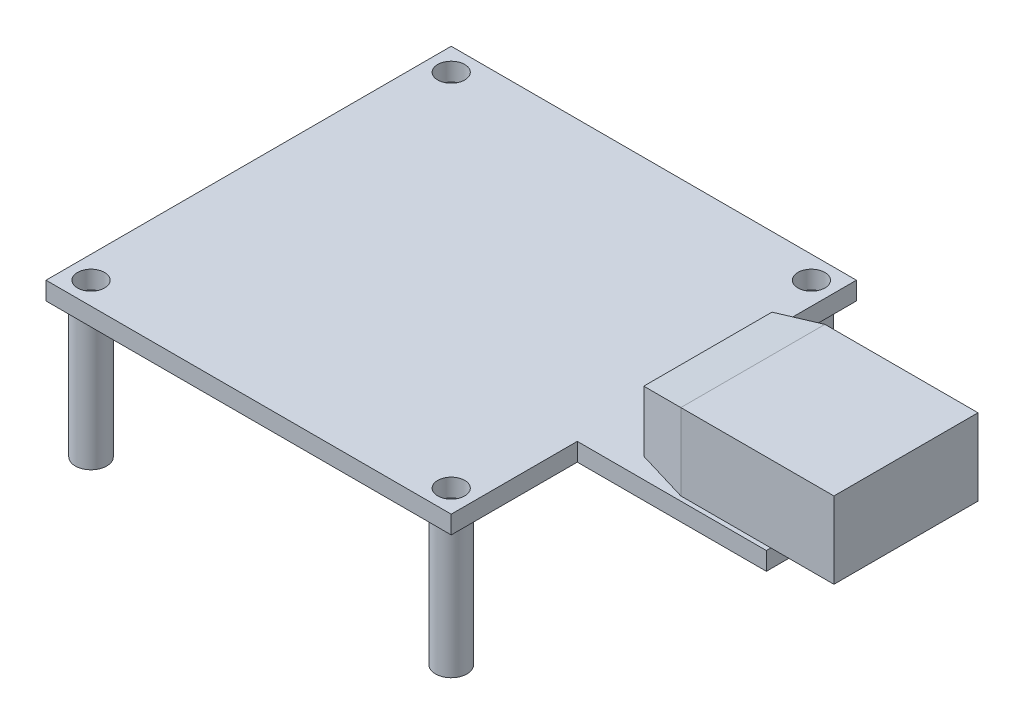
ISO-10303-21;
HEADER;
FILE_DESCRIPTION(('STEP AP214'),'2;1');
FILE_NAME('part.step','',(''),(''),'','','');
FILE_SCHEMA(('AUTOMOTIVE_DESIGN { 1 0 10303 214 1 1 1 1 }'));
ENDSEC;
DATA;
#1=APPLICATION_CONTEXT('core data for automotive mechanical design processes');
#2=APPLICATION_PROTOCOL_DEFINITION('international standard','automotive_design',2000,#1);
#3=PRODUCT_CONTEXT('',#1,'mechanical');
#4=PRODUCT('Part','Part','',(#3));
#5=PRODUCT_RELATED_PRODUCT_CATEGORY('part','',(#4));
#6=PRODUCT_DEFINITION_FORMATION('','',#4);
#7=PRODUCT_DEFINITION_CONTEXT('part definition',#1,'design');
#8=PRODUCT_DEFINITION('design','',#6,#7);
#9=PRODUCT_DEFINITION_SHAPE('','',#8);
#10=(LENGTH_UNIT() NAMED_UNIT(*) SI_UNIT(.MILLI.,.METRE.));
#11=(NAMED_UNIT(*) PLANE_ANGLE_UNIT() SI_UNIT($,.RADIAN.));
#12=(NAMED_UNIT(*) SI_UNIT($,.STERADIAN.) SOLID_ANGLE_UNIT());
#13=UNCERTAINTY_MEASURE_WITH_UNIT(LENGTH_MEASURE(1.E-05),#10,'distance_accuracy_value','');
#14=(GEOMETRIC_REPRESENTATION_CONTEXT(3) GLOBAL_UNCERTAINTY_ASSIGNED_CONTEXT((#13)) GLOBAL_UNIT_ASSIGNED_CONTEXT((#10,
#11,#12)) REPRESENTATION_CONTEXT('',''));
#15=CARTESIAN_POINT('',(0.,0.,0.));
#16=DIRECTION('',(0.,0.,1.));
#17=DIRECTION('',(1.,0.,0.));
#18=AXIS2_PLACEMENT_3D('',#15,#16,#17);
#19=CARTESIAN_POINT('',(-20.,-15.,-20.));
#20=DIRECTION('',(0.,1.,0.));
#21=DIRECTION('',(0.,0.,1.));
#22=AXIS2_PLACEMENT_3D('',#19,#20,#21);
#23=PLANE('',#22);
#24=CARTESIAN_POINT('',(-20.,-15.,-20.));
#25=DIRECTION('',(0.,-1.,0.));
#26=DIRECTION('',(0.,0.,1.));
#27=AXIS2_PLACEMENT_3D('',#24,#25,#26);
#28=CIRCLE('',#27,1.75);
#29=CARTESIAN_POINT('',(-20.,-15.,-18.25));
#30=VERTEX_POINT('',#29);
#31=EDGE_CURVE('E62',#30,#30,#28,.T.);
#32=ORIENTED_EDGE('',*,*,#31,.T.);
#33=EDGE_LOOP('',(#32));
#34=FACE_BOUND('',#33,.T.);
#35=CARTESIAN_POINT('',(-20.,-15.,-20.));
#36=DIRECTION('',(0.,-1.,0.));
#37=DIRECTION('',(0.,0.,1.));
#38=AXIS2_PLACEMENT_3D('',#35,#36,#37);
#39=CIRCLE('',#38,1.);
#40=CARTESIAN_POINT('',(-20.,-15.,-19.));
#41=VERTEX_POINT('',#40);
#42=EDGE_CURVE('E53',#41,#41,#39,.T.);
#43=ORIENTED_EDGE('',*,*,#42,.F.);
#44=EDGE_LOOP('',(#43));
#45=FACE_BOUND('',#44,.T.);
#46=ADVANCED_FACE('F49',(#34,#45),#23,.F.);
#47=CARTESIAN_POINT('',(-20.,0.,-20.));
#48=DIRECTION('',(0.,1.,0.));
#49=DIRECTION('',(0.,0.,1.));
#50=AXIS2_PLACEMENT_3D('',#47,#48,#49);
#51=PLANE('',#50);
#52=CARTESIAN_POINT('',(-20.,0.,-20.));
#53=DIRECTION('',(0.,-1.,0.));
#54=DIRECTION('',(0.,0.,1.));
#55=AXIS2_PLACEMENT_3D('',#52,#53,#54);
#56=CIRCLE('',#55,1.75);
#57=CARTESIAN_POINT('',(-20.,0.,-18.25));
#58=VERTEX_POINT('',#57);
#59=EDGE_CURVE('E60',#58,#58,#56,.T.);
#60=ORIENTED_EDGE('',*,*,#59,.F.);
#61=EDGE_LOOP('',(#60));
#62=FACE_BOUND('',#61,.T.);
#63=CARTESIAN_POINT('',(-20.,0.,-20.));
#64=DIRECTION('',(0.,-1.,0.));
#65=DIRECTION('',(0.,0.,1.));
#66=AXIS2_PLACEMENT_3D('',#63,#64,#65);
#67=CIRCLE('',#66,1.);
#68=CARTESIAN_POINT('',(-20.,0.,-19.));
#69=VERTEX_POINT('',#68);
#70=EDGE_CURVE('E11',#69,#69,#67,.T.);
#71=ORIENTED_EDGE('',*,*,#70,.T.);
#72=EDGE_LOOP('',(#71));
#73=FACE_BOUND('',#72,.T.);
#74=ADVANCED_FACE('F70',(#62,#73),#51,.T.);
#75=CARTESIAN_POINT('',(-20.,-15.,-20.));
#76=DIRECTION('',(0.,1.,0.));
#77=DIRECTION('',(0.,0.,1.));
#78=AXIS2_PLACEMENT_3D('',#75,#76,#77);
#79=CYLINDRICAL_SURFACE('',#78,1.75);
#80=ORIENTED_EDGE('',*,*,#31,.F.);
#81=EDGE_LOOP('',(#80));
#82=FACE_BOUND('',#81,.T.);
#83=ORIENTED_EDGE('',*,*,#59,.T.);
#84=EDGE_LOOP('',(#83));
#85=FACE_BOUND('',#84,.T.);
#86=ADVANCED_FACE('F68',(#82,#85),#79,.T.);
#87=CARTESIAN_POINT('',(-20.,-15.,-20.));
#88=DIRECTION('',(0.,1.,0.));
#89=DIRECTION('',(0.,0.,1.));
#90=AXIS2_PLACEMENT_3D('',#87,#88,#89);
#91=CYLINDRICAL_SURFACE('',#90,1.);
#92=ORIENTED_EDGE('',*,*,#42,.T.);
#93=EDGE_LOOP('',(#92));
#94=FACE_BOUND('',#93,.T.);
#95=ORIENTED_EDGE('',*,*,#70,.F.);
#96=EDGE_LOOP('',(#95));
#97=FACE_BOUND('',#96,.T.);
#98=ADVANCED_FACE('F51',(#94,#97),#91,.F.);
#99=CLOSED_SHELL('',(#46,#74,#86,#98));
#100=MANIFOLD_SOLID_BREP('B2',#99);
#101=CARTESIAN_POINT('',(20.,-15.,-20.));
#102=DIRECTION('',(0.,-1.,0.));
#103=DIRECTION('',(0.,0.,-1.));
#104=AXIS2_PLACEMENT_3D('',#101,#102,#103);
#105=PLANE('',#104);
#106=CARTESIAN_POINT('',(20.,-15.,-20.));
#107=DIRECTION('',(0.,-1.,0.));
#108=DIRECTION('',(0.,0.,-1.));
#109=AXIS2_PLACEMENT_3D('',#106,#107,#108);
#110=CIRCLE('',#109,1.75);
#111=CARTESIAN_POINT('',(20.,-15.,-21.75));
#112=VERTEX_POINT('',#111);
#113=EDGE_CURVE('E139',#112,#112,#110,.T.);
#114=ORIENTED_EDGE('',*,*,#113,.T.);
#115=EDGE_LOOP('',(#114));
#116=FACE_BOUND('',#115,.T.);
#117=CARTESIAN_POINT('',(20.,-15.,-20.));
#118=DIRECTION('',(0.,-1.,0.));
#119=DIRECTION('',(0.,0.,-1.));
#120=AXIS2_PLACEMENT_3D('',#117,#118,#119);
#121=CIRCLE('',#120,1.);
#122=CARTESIAN_POINT('',(20.,-15.,-21.));
#123=VERTEX_POINT('',#122);
#124=EDGE_CURVE('E130',#123,#123,#121,.T.);
#125=ORIENTED_EDGE('',*,*,#124,.F.);
#126=EDGE_LOOP('',(#125));
#127=FACE_BOUND('',#126,.T.);
#128=ADVANCED_FACE('F126',(#116,#127),#105,.T.);
#129=CARTESIAN_POINT('',(20.,0.,-20.));
#130=DIRECTION('',(0.,-1.,0.));
#131=DIRECTION('',(0.,0.,-1.));
#132=AXIS2_PLACEMENT_3D('',#129,#130,#131);
#133=PLANE('',#132);
#134=CARTESIAN_POINT('',(20.,0.,-20.));
#135=DIRECTION('',(0.,-1.,0.));
#136=DIRECTION('',(0.,0.,-1.));
#137=AXIS2_PLACEMENT_3D('',#134,#135,#136);
#138=CIRCLE('',#137,1.75);
#139=CARTESIAN_POINT('',(20.,0.,-21.75));
#140=VERTEX_POINT('',#139);
#141=EDGE_CURVE('E137',#140,#140,#138,.T.);
#142=ORIENTED_EDGE('',*,*,#141,.F.);
#143=EDGE_LOOP('',(#142));
#144=FACE_BOUND('',#143,.T.);
#145=CARTESIAN_POINT('',(20.,0.,-20.));
#146=DIRECTION('',(0.,-1.,0.));
#147=DIRECTION('',(0.,0.,-1.));
#148=AXIS2_PLACEMENT_3D('',#145,#146,#147);
#149=CIRCLE('',#148,1.);
#150=CARTESIAN_POINT('',(20.,0.,-21.));
#151=VERTEX_POINT('',#150);
#152=EDGE_CURVE('E48',#151,#151,#149,.T.);
#153=ORIENTED_EDGE('',*,*,#152,.T.);
#154=EDGE_LOOP('',(#153));
#155=FACE_BOUND('',#154,.T.);
#156=ADVANCED_FACE('F147',(#144,#155),#133,.F.);
#157=CARTESIAN_POINT('',(20.,-15.,-20.));
#158=DIRECTION('',(0.,1.,0.));
#159=DIRECTION('',(0.,0.,1.));
#160=AXIS2_PLACEMENT_3D('',#157,#158,#159);
#161=CYLINDRICAL_SURFACE('',#160,1.75);
#162=ORIENTED_EDGE('',*,*,#113,.F.);
#163=EDGE_LOOP('',(#162));
#164=FACE_BOUND('',#163,.T.);
#165=ORIENTED_EDGE('',*,*,#141,.T.);
#166=EDGE_LOOP('',(#165));
#167=FACE_BOUND('',#166,.T.);
#168=ADVANCED_FACE('F145',(#164,#167),#161,.T.);
#169=CARTESIAN_POINT('',(20.,-15.,-20.));
#170=DIRECTION('',(0.,1.,0.));
#171=DIRECTION('',(0.,0.,1.));
#172=AXIS2_PLACEMENT_3D('',#169,#170,#171);
#173=CYLINDRICAL_SURFACE('',#172,1.);
#174=ORIENTED_EDGE('',*,*,#124,.T.);
#175=EDGE_LOOP('',(#174));
#176=FACE_BOUND('',#175,.T.);
#177=ORIENTED_EDGE('',*,*,#152,.F.);
#178=EDGE_LOOP('',(#177));
#179=FACE_BOUND('',#178,.T.);
#180=ADVANCED_FACE('F128',(#176,#179),#173,.F.);
#181=CLOSED_SHELL('',(#128,#156,#168,#180));
#182=MANIFOLD_SOLID_BREP('B6',#181);
#183=CARTESIAN_POINT('',(20.,-15.,20.));
#184=DIRECTION('',(0.,1.,0.));
#185=DIRECTION('',(0.,0.,1.));
#186=AXIS2_PLACEMENT_3D('',#183,#184,#185);
#187=PLANE('',#186);
#188=CARTESIAN_POINT('',(20.,-15.,20.));
#189=DIRECTION('',(0.,-1.,0.));
#190=DIRECTION('',(0.,0.,1.));
#191=AXIS2_PLACEMENT_3D('',#188,#189,#190);
#192=CIRCLE('',#191,1.75);
#193=CARTESIAN_POINT('',(20.,-15.,21.75));
#194=VERTEX_POINT('',#193);
#195=EDGE_CURVE('E216',#194,#194,#192,.T.);
#196=ORIENTED_EDGE('',*,*,#195,.T.);
#197=EDGE_LOOP('',(#196));
#198=FACE_BOUND('',#197,.T.);
#199=CARTESIAN_POINT('',(20.,-15.,20.));
#200=DIRECTION('',(0.,-1.,0.));
#201=DIRECTION('',(0.,0.,1.));
#202=AXIS2_PLACEMENT_3D('',#199,#200,#201);
#203=CIRCLE('',#202,1.);
#204=CARTESIAN_POINT('',(20.,-15.,21.));
#205=VERTEX_POINT('',#204);
#206=EDGE_CURVE('E207',#205,#205,#203,.T.);
#207=ORIENTED_EDGE('',*,*,#206,.F.);
#208=EDGE_LOOP('',(#207));
#209=FACE_BOUND('',#208,.T.);
#210=ADVANCED_FACE('F203',(#198,#209),#187,.F.);
#211=CARTESIAN_POINT('',(20.,0.,20.));
#212=DIRECTION('',(0.,1.,0.));
#213=DIRECTION('',(0.,0.,1.));
#214=AXIS2_PLACEMENT_3D('',#211,#212,#213);
#215=PLANE('',#214);
#216=CARTESIAN_POINT('',(20.,0.,20.));
#217=DIRECTION('',(0.,-1.,0.));
#218=DIRECTION('',(0.,0.,1.));
#219=AXIS2_PLACEMENT_3D('',#216,#217,#218);
#220=CIRCLE('',#219,1.75);
#221=CARTESIAN_POINT('',(20.,0.,21.75));
#222=VERTEX_POINT('',#221);
#223=EDGE_CURVE('E214',#222,#222,#220,.T.);
#224=ORIENTED_EDGE('',*,*,#223,.F.);
#225=EDGE_LOOP('',(#224));
#226=FACE_BOUND('',#225,.T.);
#227=CARTESIAN_POINT('',(20.,0.,20.));
#228=DIRECTION('',(0.,-1.,0.));
#229=DIRECTION('',(0.,0.,1.));
#230=AXIS2_PLACEMENT_3D('',#227,#228,#229);
#231=CIRCLE('',#230,1.);
#232=CARTESIAN_POINT('',(20.,0.,21.));
#233=VERTEX_POINT('',#232);
#234=EDGE_CURVE('E125',#233,#233,#231,.T.);
#235=ORIENTED_EDGE('',*,*,#234,.T.);
#236=EDGE_LOOP('',(#235));
#237=FACE_BOUND('',#236,.T.);
#238=ADVANCED_FACE('F224',(#226,#237),#215,.T.);
#239=CARTESIAN_POINT('',(20.,-15.,20.));
#240=DIRECTION('',(0.,1.,0.));
#241=DIRECTION('',(0.,0.,1.));
#242=AXIS2_PLACEMENT_3D('',#239,#240,#241);
#243=CYLINDRICAL_SURFACE('',#242,1.75);
#244=ORIENTED_EDGE('',*,*,#195,.F.);
#245=EDGE_LOOP('',(#244));
#246=FACE_BOUND('',#245,.T.);
#247=ORIENTED_EDGE('',*,*,#223,.T.);
#248=EDGE_LOOP('',(#247));
#249=FACE_BOUND('',#248,.T.);
#250=ADVANCED_FACE('F222',(#246,#249),#243,.T.);
#251=CARTESIAN_POINT('',(20.,-15.,20.));
#252=DIRECTION('',(0.,1.,0.));
#253=DIRECTION('',(0.,0.,1.));
#254=AXIS2_PLACEMENT_3D('',#251,#252,#253);
#255=CYLINDRICAL_SURFACE('',#254,1.);
#256=ORIENTED_EDGE('',*,*,#206,.T.);
#257=EDGE_LOOP('',(#256));
#258=FACE_BOUND('',#257,.T.);
#259=ORIENTED_EDGE('',*,*,#234,.F.);
#260=EDGE_LOOP('',(#259));
#261=FACE_BOUND('',#260,.T.);
#262=ADVANCED_FACE('F205',(#258,#261),#255,.F.);
#263=CLOSED_SHELL('',(#210,#238,#250,#262));
#264=MANIFOLD_SOLID_BREP('B43',#263);
#265=CARTESIAN_POINT('',(-20.,-15.,20.));
#266=DIRECTION('',(0.,-1.,0.));
#267=DIRECTION('',(0.,0.,-1.));
#268=AXIS2_PLACEMENT_3D('',#265,#266,#267);
#269=PLANE('',#268);
#270=CARTESIAN_POINT('',(-20.,-15.,20.));
#271=DIRECTION('',(0.,-1.,0.));
#272=DIRECTION('',(0.,0.,-1.));
#273=AXIS2_PLACEMENT_3D('',#270,#271,#272);
#274=CIRCLE('',#273,1.75);
#275=CARTESIAN_POINT('',(-20.,-15.,18.25));
#276=VERTEX_POINT('',#275);
#277=EDGE_CURVE('E202',#276,#276,#274,.T.);
#278=ORIENTED_EDGE('',*,*,#277,.T.);
#279=EDGE_LOOP('',(#278));
#280=FACE_BOUND('',#279,.T.);
#281=CARTESIAN_POINT('',(-20.,-15.,20.));
#282=DIRECTION('',(0.,-1.,0.));
#283=DIRECTION('',(0.,0.,-1.));
#284=AXIS2_PLACEMENT_3D('',#281,#282,#283);
#285=CIRCLE('',#284,1.);
#286=CARTESIAN_POINT('',(-20.,-15.,19.));
#287=VERTEX_POINT('',#286);
#288=EDGE_CURVE('E292',#287,#287,#285,.T.);
#289=ORIENTED_EDGE('',*,*,#288,.F.);
#290=EDGE_LOOP('',(#289));
#291=FACE_BOUND('',#290,.T.);
#292=ADVANCED_FACE('F281',(#280,#291),#269,.T.);
#293=CARTESIAN_POINT('',(-20.,0.,20.));
#294=DIRECTION('',(0.,-1.,0.));
#295=DIRECTION('',(0.,0.,-1.));
#296=AXIS2_PLACEMENT_3D('',#293,#294,#295);
#297=PLANE('',#296);
#298=CARTESIAN_POINT('',(-20.,0.,20.));
#299=DIRECTION('',(0.,-1.,0.));
#300=DIRECTION('',(0.,0.,-1.));
#301=AXIS2_PLACEMENT_3D('',#298,#299,#300);
#302=CIRCLE('',#301,1.75);
#303=CARTESIAN_POINT('',(-20.,0.,18.25));
#304=VERTEX_POINT('',#303);
#305=EDGE_CURVE('E285',#304,#304,#302,.T.);
#306=ORIENTED_EDGE('',*,*,#305,.F.);
#307=EDGE_LOOP('',(#306));
#308=FACE_BOUND('',#307,.T.);
#309=CARTESIAN_POINT('',(-20.,0.,20.));
#310=DIRECTION('',(0.,-1.,0.));
#311=DIRECTION('',(0.,0.,-1.));
#312=AXIS2_PLACEMENT_3D('',#309,#310,#311);
#313=CIRCLE('',#312,1.);
#314=CARTESIAN_POINT('',(-20.,0.,19.));
#315=VERTEX_POINT('',#314);
#316=EDGE_CURVE('E294',#315,#315,#313,.T.);
#317=ORIENTED_EDGE('',*,*,#316,.T.);
#318=EDGE_LOOP('',(#317));
#319=FACE_BOUND('',#318,.T.);
#320=ADVANCED_FACE('F304',(#308,#319),#297,.F.);
#321=CARTESIAN_POINT('',(-20.,-15.,20.));
#322=DIRECTION('',(0.,1.,0.));
#323=DIRECTION('',(0.,0.,1.));
#324=AXIS2_PLACEMENT_3D('',#321,#322,#323);
#325=CYLINDRICAL_SURFACE('',#324,1.75);
#326=ORIENTED_EDGE('',*,*,#277,.F.);
#327=EDGE_LOOP('',(#326));
#328=FACE_BOUND('',#327,.T.);
#329=ORIENTED_EDGE('',*,*,#305,.T.);
#330=EDGE_LOOP('',(#329));
#331=FACE_BOUND('',#330,.T.);
#332=ADVANCED_FACE('F283',(#328,#331),#325,.T.);
#333=CARTESIAN_POINT('',(-20.,-15.,20.));
#334=DIRECTION('',(0.,1.,0.));
#335=DIRECTION('',(0.,0.,1.));
#336=AXIS2_PLACEMENT_3D('',#333,#334,#335);
#337=CYLINDRICAL_SURFACE('',#336,1.);
#338=ORIENTED_EDGE('',*,*,#288,.T.);
#339=EDGE_LOOP('',(#338));
#340=FACE_BOUND('',#339,.T.);
#341=ORIENTED_EDGE('',*,*,#316,.F.);
#342=EDGE_LOOP('',(#341));
#343=FACE_BOUND('',#342,.T.);
#344=ADVANCED_FACE('F300',(#340,#343),#337,.F.);
#345=CLOSED_SHELL('',(#292,#320,#332,#344));
#346=MANIFOLD_SOLID_BREP('B120',#345);
#347=CARTESIAN_POINT('',(0.,2.,0.));
#348=DIRECTION('',(0.,1.,0.));
#349=DIRECTION('',(0.,0.,1.));
#350=AXIS2_PLACEMENT_3D('',#347,#348,#349);
#351=PLANE('',#350);
#352=CARTESIAN_POINT('',(20.,2.,20.));
#353=DIRECTION('',(0.,1.,0.));
#354=DIRECTION('',(0.,0.,1.));
#355=AXIS2_PLACEMENT_3D('',#352,#353,#354);
#356=CIRCLE('',#355,1.5);
#357=CARTESIAN_POINT('',(20.,2.,21.5));
#358=VERTEX_POINT('',#357);
#359=EDGE_CURVE('E530',#358,#358,#356,.T.);
#360=ORIENTED_EDGE('',*,*,#359,.F.);
#361=EDGE_LOOP('',(#360));
#362=FACE_BOUND('',#361,.T.);
#363=CARTESIAN_POINT('',(20.,2.,-20.));
#364=DIRECTION('',(0.,1.,0.));
#365=DIRECTION('',(0.,0.,1.));
#366=AXIS2_PLACEMENT_3D('',#363,#364,#365);
#367=CIRCLE('',#366,1.5);
#368=CARTESIAN_POINT('',(20.,2.,-18.5));
#369=VERTEX_POINT('',#368);
#370=EDGE_CURVE('E534',#369,#369,#367,.F.);
#371=ORIENTED_EDGE('',*,*,#370,.T.);
#372=EDGE_LOOP('',(#371));
#373=FACE_BOUND('',#372,.T.);
#374=CARTESIAN_POINT('',(-20.,2.,-20.));
#375=DIRECTION('',(0.,1.,0.));
#376=DIRECTION('',(0.,0.,1.));
#377=AXIS2_PLACEMENT_3D('',#374,#375,#376);
#378=CIRCLE('',#377,1.5);
#379=CARTESIAN_POINT('',(-20.,2.,-18.5));
#380=VERTEX_POINT('',#379);
#381=EDGE_CURVE('E539',#380,#380,#378,.T.);
#382=ORIENTED_EDGE('',*,*,#381,.F.);
#383=EDGE_LOOP('',(#382));
#384=FACE_BOUND('',#383,.T.);
#385=CARTESIAN_POINT('',(-20.,2.,20.));
#386=DIRECTION('',(0.,1.,0.));
#387=DIRECTION('',(0.,0.,1.));
#388=AXIS2_PLACEMENT_3D('',#385,#386,#387);
#389=CIRCLE('',#388,1.5);
#390=CARTESIAN_POINT('',(-20.,2.,21.5));
#391=VERTEX_POINT('',#390);
#392=EDGE_CURVE('E570',#391,#391,#389,.F.);
#393=ORIENTED_EDGE('',*,*,#392,.T.);
#394=EDGE_LOOP('',(#393));
#395=FACE_BOUND('',#394,.T.);
#396=DIRECTION('',(0.,0.,1.));
#397=VECTOR('',#396,1.);
#398=CARTESIAN_POINT('',(43.5,2.,0.));
#399=LINE('',#398,#397);
#400=CARTESIAN_POINT('',(43.5,2.,8.));
#401=VERTEX_POINT('',#400);
#402=CARTESIAN_POINT('',(43.5,2.,8.50000000000001));
#403=VERTEX_POINT('',#402);
#404=EDGE_CURVE('E369',#401,#403,#399,.T.);
#405=ORIENTED_EDGE('',*,*,#404,.F.);
#406=DIRECTION('',(-1.,0.,0.));
#407=VECTOR('',#406,1.);
#408=CARTESIAN_POINT('',(50.5,2.,8.));
#409=LINE('',#408,#407);
#410=CARTESIAN_POINT('',(33.5,2.,8.));
#411=VERTEX_POINT('',#410);
#412=EDGE_CURVE('E279',#401,#411,#409,.T.);
#413=ORIENTED_EDGE('',*,*,#412,.T.);
#414=DIRECTION('',(0.,0.,-1.));
#415=VECTOR('',#414,1.);
#416=CARTESIAN_POINT('',(33.5,2.,8.));
#417=LINE('',#416,#415);
#418=CARTESIAN_POINT('',(33.5,2.,-8.));
#419=VERTEX_POINT('',#418);
#420=EDGE_CURVE('E476',#411,#419,#417,.T.);
#421=ORIENTED_EDGE('',*,*,#420,.T.);
#422=DIRECTION('',(-1.,0.,0.));
#423=VECTOR('',#422,1.);
#424=CARTESIAN_POINT('',(50.5,2.,-8.));
#425=LINE('',#424,#423);
#426=CARTESIAN_POINT('',(43.5,2.,-8.));
#427=VERTEX_POINT('',#426);
#428=EDGE_CURVE('E361',#427,#419,#425,.T.);
#429=ORIENTED_EDGE('',*,*,#428,.F.);
#430=CARTESIAN_POINT('',(43.5,2.,-8.49999999999999));
#431=VERTEX_POINT('',#430);
#432=EDGE_CURVE('E554',#431,#427,#399,.T.);
#433=ORIENTED_EDGE('',*,*,#432,.F.);
#434=DIRECTION('',(1.,0.,0.));
#435=VECTOR('',#434,1.);
#436=CARTESIAN_POINT('',(0.,2.,-8.49999999999999));
#437=LINE('',#436,#435);
#438=CARTESIAN_POINT('',(22.5,2.,-8.49999999999999));
#439=VERTEX_POINT('',#438);
#440=EDGE_CURVE('E557',#439,#431,#437,.T.);
#441=ORIENTED_EDGE('',*,*,#440,.F.);
#442=DIRECTION('',(0.,0.,-1.));
#443=VECTOR('',#442,1.);
#444=CARTESIAN_POINT('',(22.5,2.,0.));
#445=LINE('',#444,#443);
#446=CARTESIAN_POINT('',(22.5,2.,-22.5));
#447=VERTEX_POINT('',#446);
#448=EDGE_CURVE('E551',#439,#447,#445,.T.);
#449=ORIENTED_EDGE('',*,*,#448,.T.);
#450=DIRECTION('',(1.,0.,0.));
#451=VECTOR('',#450,1.);
#452=CARTESIAN_POINT('',(0.,2.,-22.5));
#453=LINE('',#452,#451);
#454=CARTESIAN_POINT('',(-22.5,2.,-22.5));
#455=VERTEX_POINT('',#454);
#456=EDGE_CURVE('E562',#455,#447,#453,.T.);
#457=ORIENTED_EDGE('',*,*,#456,.F.);
#458=DIRECTION('',(0.,0.,-1.));
#459=VECTOR('',#458,1.);
#460=CARTESIAN_POINT('',(-22.5,2.,0.));
#461=LINE('',#460,#459);
#462=CARTESIAN_POINT('',(-22.5,2.,22.5));
#463=VERTEX_POINT('',#462);
#464=EDGE_CURVE('E566',#463,#455,#461,.T.);
#465=ORIENTED_EDGE('',*,*,#464,.F.);
#466=DIRECTION('',(1.,0.,0.));
#467=VECTOR('',#466,1.);
#468=CARTESIAN_POINT('',(0.,2.,22.5));
#469=LINE('',#468,#467);
#470=CARTESIAN_POINT('',(22.5,2.,22.5));
#471=VERTEX_POINT('',#470);
#472=EDGE_CURVE('E543',#463,#471,#469,.T.);
#473=ORIENTED_EDGE('',*,*,#472,.T.);
#474=CARTESIAN_POINT('',(22.5,2.,8.50000000000001));
#475=VERTEX_POINT('',#474);
#476=EDGE_CURVE('E547',#471,#475,#445,.T.);
#477=ORIENTED_EDGE('',*,*,#476,.T.);
#478=DIRECTION('',(1.,0.,0.));
#479=VECTOR('',#478,1.);
#480=CARTESIAN_POINT('',(0.,2.,8.50000000000001));
#481=LINE('',#480,#479);
#482=EDGE_CURVE('E550',#475,#403,#481,.T.);
#483=ORIENTED_EDGE('',*,*,#482,.T.);
#484=EDGE_LOOP('',(#405,#413,#421,#429,#433,#441,#449,#457,#465,#473,#477,#483));
#485=FACE_BOUND('',#484,.T.);
#486=ADVANCED_FACE('F351',(#362,#373,#384,#395,#485),#351,.T.);
#487=CARTESIAN_POINT('',(0.,2.,22.5));
#488=DIRECTION('',(0.,0.,-1.));
#489=DIRECTION('',(-1.,0.,0.));
#490=AXIS2_PLACEMENT_3D('',#487,#488,#489);
#491=PLANE('',#490);
#492=DIRECTION('',(1.,0.,0.));
#493=VECTOR('',#492,1.);
#494=CARTESIAN_POINT('',(0.,0.,22.5));
#495=LINE('',#494,#493);
#496=CARTESIAN_POINT('',(-22.5,0.,22.5));
#497=VERTEX_POINT('',#496);
#498=CARTESIAN_POINT('',(22.5,0.,22.5));
#499=VERTEX_POINT('',#498);
#500=EDGE_CURVE('E586',#497,#499,#495,.T.);
#501=ORIENTED_EDGE('',*,*,#500,.T.);
#502=DIRECTION('',(0.,-1.,0.));
#503=VECTOR('',#502,1.);
#504=CARTESIAN_POINT('',(22.5,2.,22.5));
#505=LINE('',#504,#503);
#506=EDGE_CURVE('E355',#471,#499,#505,.T.);
#507=ORIENTED_EDGE('',*,*,#506,.F.);
#508=ORIENTED_EDGE('',*,*,#472,.F.);
#509=DIRECTION('',(0.,-1.,0.));
#510=VECTOR('',#509,1.);
#511=CARTESIAN_POINT('',(-22.5,2.,22.5));
#512=LINE('',#511,#510);
#513=EDGE_CURVE('E574',#463,#497,#512,.T.);
#514=ORIENTED_EDGE('',*,*,#513,.T.);
#515=EDGE_LOOP('',(#501,#507,#508,#514));
#516=FACE_BOUND('',#515,.T.);
#517=ADVANCED_FACE('F684',(#516),#491,.F.);
#518=CARTESIAN_POINT('',(22.5,2.,0.));
#519=DIRECTION('',(-1.,0.,0.));
#520=DIRECTION('',(0.,0.,1.));
#521=AXIS2_PLACEMENT_3D('',#518,#519,#520);
#522=PLANE('',#521);
#523=DIRECTION('',(0.,0.,-1.));
#524=VECTOR('',#523,1.);
#525=CARTESIAN_POINT('',(22.5,0.,0.));
#526=LINE('',#525,#524);
#527=CARTESIAN_POINT('',(22.5,0.,8.50000000000001));
#528=VERTEX_POINT('',#527);
#529=EDGE_CURVE('E590',#499,#528,#526,.T.);
#530=ORIENTED_EDGE('',*,*,#529,.T.);
#531=DIRECTION('',(0.,-1.,0.));
#532=VECTOR('',#531,1.);
#533=CARTESIAN_POINT('',(22.5,2.,8.50000000000001));
#534=LINE('',#533,#532);
#535=EDGE_CURVE('E633',#475,#528,#534,.T.);
#536=ORIENTED_EDGE('',*,*,#535,.F.);
#537=ORIENTED_EDGE('',*,*,#476,.F.);
#538=ORIENTED_EDGE('',*,*,#506,.T.);
#539=EDGE_LOOP('',(#530,#536,#537,#538));
#540=FACE_BOUND('',#539,.T.);
#541=ADVANCED_FACE('F685',(#540),#522,.F.);
#542=CARTESIAN_POINT('',(0.,2.,8.50000000000001));
#543=DIRECTION('',(0.,0.,-1.));
#544=DIRECTION('',(-1.,0.,0.));
#545=AXIS2_PLACEMENT_3D('',#542,#543,#544);
#546=PLANE('',#545);
#547=DIRECTION('',(1.,0.,0.));
#548=VECTOR('',#547,1.);
#549=CARTESIAN_POINT('',(0.,0.,8.50000000000001));
#550=LINE('',#549,#548);
#551=CARTESIAN_POINT('',(43.5,0.,8.50000000000001));
#552=VERTEX_POINT('',#551);
#553=EDGE_CURVE('E593',#528,#552,#550,.T.);
#554=ORIENTED_EDGE('',*,*,#553,.T.);
#555=DIRECTION('',(0.,-1.,0.));
#556=VECTOR('',#555,1.);
#557=CARTESIAN_POINT('',(43.5,2.,8.50000000000001));
#558=LINE('',#557,#556);
#559=EDGE_CURVE('E631',#403,#552,#558,.T.);
#560=ORIENTED_EDGE('',*,*,#559,.F.);
#561=ORIENTED_EDGE('',*,*,#482,.F.);
#562=ORIENTED_EDGE('',*,*,#535,.T.);
#563=EDGE_LOOP('',(#554,#560,#561,#562));
#564=FACE_BOUND('',#563,.T.);
#565=ADVANCED_FACE('F659',(#564),#546,.F.);
#566=CARTESIAN_POINT('',(43.5,2.,0.));
#567=DIRECTION('',(1.,0.,0.));
#568=DIRECTION('',(0.,0.,-1.));
#569=AXIS2_PLACEMENT_3D('',#566,#567,#568);
#570=PLANE('',#569);
#571=DIRECTION('',(0.,0.,1.));
#572=VECTOR('',#571,1.);
#573=CARTESIAN_POINT('',(43.5,0.,0.));
#574=LINE('',#573,#572);
#575=CARTESIAN_POINT('',(43.5,0.,-8.49999999999999));
#576=VERTEX_POINT('',#575);
#577=EDGE_CURVE('E598',#576,#552,#574,.T.);
#578=ORIENTED_EDGE('',*,*,#577,.F.);
#579=DIRECTION('',(0.,-1.,0.));
#580=VECTOR('',#579,1.);
#581=CARTESIAN_POINT('',(43.5,2.,-8.49999999999999));
#582=LINE('',#581,#580);
#583=EDGE_CURVE('E628',#431,#576,#582,.T.);
#584=ORIENTED_EDGE('',*,*,#583,.F.);
#585=ORIENTED_EDGE('',*,*,#432,.T.);
#586=EDGE_CURVE('E558',#427,#401,#399,.T.);
#587=ORIENTED_EDGE('',*,*,#586,.T.);
#588=ORIENTED_EDGE('',*,*,#404,.T.);
#589=ORIENTED_EDGE('',*,*,#559,.T.);
#590=EDGE_LOOP('',(#578,#584,#585,#587,#588,#589));
#591=FACE_BOUND('',#590,.T.);
#592=ADVANCED_FACE('F657',(#591),#570,.T.);
#593=CARTESIAN_POINT('',(0.,2.,-8.49999999999999));
#594=DIRECTION('',(0.,0.,-1.));
#595=DIRECTION('',(-1.,0.,0.));
#596=AXIS2_PLACEMENT_3D('',#593,#594,#595);
#597=PLANE('',#596);
#598=DIRECTION('',(1.,0.,0.));
#599=VECTOR('',#598,1.);
#600=CARTESIAN_POINT('',(0.,0.,-8.49999999999999));
#601=LINE('',#600,#599);
#602=CARTESIAN_POINT('',(22.5,0.,-8.49999999999999));
#603=VERTEX_POINT('',#602);
#604=EDGE_CURVE('E602',#603,#576,#601,.T.);
#605=ORIENTED_EDGE('',*,*,#604,.F.);
#606=DIRECTION('',(0.,-1.,0.));
#607=VECTOR('',#606,1.);
#608=CARTESIAN_POINT('',(22.5,2.,-8.49999999999999));
#609=LINE('',#608,#607);
#610=EDGE_CURVE('E625',#439,#603,#609,.T.);
#611=ORIENTED_EDGE('',*,*,#610,.F.);
#612=ORIENTED_EDGE('',*,*,#440,.T.);
#613=ORIENTED_EDGE('',*,*,#583,.T.);
#614=EDGE_LOOP('',(#605,#611,#612,#613));
#615=FACE_BOUND('',#614,.T.);
#616=ADVANCED_FACE('F668',(#615),#597,.T.);
#617=CARTESIAN_POINT('',(22.5,0.,-22.5));
#618=VERTEX_POINT('',#617);
#619=EDGE_CURVE('E594',#603,#618,#526,.T.);
#620=ORIENTED_EDGE('',*,*,#619,.T.);
#621=DIRECTION('',(0.,-1.,0.));
#622=VECTOR('',#621,1.);
#623=CARTESIAN_POINT('',(22.5,2.,-22.5));
#624=LINE('',#623,#622);
#625=EDGE_CURVE('E622',#447,#618,#624,.T.);
#626=ORIENTED_EDGE('',*,*,#625,.F.);
#627=ORIENTED_EDGE('',*,*,#448,.F.);
#628=ORIENTED_EDGE('',*,*,#610,.T.);
#629=EDGE_LOOP('',(#620,#626,#627,#628));
#630=FACE_BOUND('',#629,.T.);
#631=ADVANCED_FACE('F673',(#630),#522,.F.);
#632=CARTESIAN_POINT('',(0.,2.,-22.5));
#633=DIRECTION('',(0.,0.,-1.));
#634=DIRECTION('',(-1.,0.,0.));
#635=AXIS2_PLACEMENT_3D('',#632,#633,#634);
#636=PLANE('',#635);
#637=DIRECTION('',(1.,0.,0.));
#638=VECTOR('',#637,1.);
#639=CARTESIAN_POINT('',(0.,0.,-22.5));
#640=LINE('',#639,#638);
#641=CARTESIAN_POINT('',(-22.5,0.,-22.5));
#642=VERTEX_POINT('',#641);
#643=EDGE_CURVE('E606',#642,#618,#640,.T.);
#644=ORIENTED_EDGE('',*,*,#643,.F.);
#645=DIRECTION('',(0.,-1.,0.));
#646=VECTOR('',#645,1.);
#647=CARTESIAN_POINT('',(-22.5,2.,-22.5));
#648=LINE('',#647,#646);
#649=EDGE_CURVE('E619',#455,#642,#648,.T.);
#650=ORIENTED_EDGE('',*,*,#649,.F.);
#651=ORIENTED_EDGE('',*,*,#456,.T.);
#652=ORIENTED_EDGE('',*,*,#625,.T.);
#653=EDGE_LOOP('',(#644,#650,#651,#652));
#654=FACE_BOUND('',#653,.T.);
#655=ADVANCED_FACE('F697',(#654),#636,.T.);
#656=CARTESIAN_POINT('',(-22.5,2.,0.));
#657=DIRECTION('',(-1.,0.,0.));
#658=DIRECTION('',(0.,0.,1.));
#659=AXIS2_PLACEMENT_3D('',#656,#657,#658);
#660=PLANE('',#659);
#661=DIRECTION('',(0.,0.,-1.));
#662=VECTOR('',#661,1.);
#663=CARTESIAN_POINT('',(-22.5,0.,0.));
#664=LINE('',#663,#662);
#665=EDGE_CURVE('E610',#497,#642,#664,.T.);
#666=ORIENTED_EDGE('',*,*,#665,.F.);
#667=ORIENTED_EDGE('',*,*,#513,.F.);
#668=ORIENTED_EDGE('',*,*,#464,.T.);
#669=ORIENTED_EDGE('',*,*,#649,.T.);
#670=EDGE_LOOP('',(#666,#667,#668,#669));
#671=FACE_BOUND('',#670,.T.);
#672=ADVANCED_FACE('F680',(#671),#660,.T.);
#673=CARTESIAN_POINT('',(-20.,2.,-20.));
#674=DIRECTION('',(0.,-1.,0.));
#675=DIRECTION('',(0.,0.,-1.));
#676=AXIS2_PLACEMENT_3D('',#673,#674,#675);
#677=CYLINDRICAL_SURFACE('',#676,1.5);
#678=ORIENTED_EDGE('',*,*,#381,.T.);
#679=EDGE_LOOP('',(#678));
#680=FACE_BOUND('',#679,.T.);
#681=CARTESIAN_POINT('',(-20.,0.,-20.));
#682=DIRECTION('',(0.,1.,0.));
#683=DIRECTION('',(0.,0.,1.));
#684=AXIS2_PLACEMENT_3D('',#681,#682,#683);
#685=CIRCLE('',#684,1.5);
#686=CARTESIAN_POINT('',(-20.,0.,-18.5));
#687=VERTEX_POINT('',#686);
#688=EDGE_CURVE('E582',#687,#687,#685,.T.);
#689=ORIENTED_EDGE('',*,*,#688,.F.);
#690=EDGE_LOOP('',(#689));
#691=FACE_BOUND('',#690,.T.);
#692=ADVANCED_FACE('F718',(#680,#691),#677,.F.);
#693=CARTESIAN_POINT('',(20.,2.,-20.));
#694=DIRECTION('',(0.,-1.,0.));
#695=DIRECTION('',(0.,0.,-1.));
#696=AXIS2_PLACEMENT_3D('',#693,#694,#695);
#697=CYLINDRICAL_SURFACE('',#696,1.5);
#698=ORIENTED_EDGE('',*,*,#370,.F.);
#699=EDGE_LOOP('',(#698));
#700=FACE_BOUND('',#699,.T.);
#701=CARTESIAN_POINT('',(20.,0.,-20.));
#702=DIRECTION('',(0.,1.,0.));
#703=DIRECTION('',(0.,0.,1.));
#704=AXIS2_PLACEMENT_3D('',#701,#702,#703);
#705=CIRCLE('',#704,1.5);
#706=CARTESIAN_POINT('',(20.,0.,-18.5));
#707=VERTEX_POINT('',#706);
#708=EDGE_CURVE('E578',#707,#707,#705,.F.);
#709=ORIENTED_EDGE('',*,*,#708,.T.);
#710=EDGE_LOOP('',(#709));
#711=FACE_BOUND('',#710,.T.);
#712=ADVANCED_FACE('F736',(#700,#711),#697,.F.);
#713=CARTESIAN_POINT('',(20.,2.,20.));
#714=DIRECTION('',(0.,-1.,0.));
#715=DIRECTION('',(0.,0.,-1.));
#716=AXIS2_PLACEMENT_3D('',#713,#714,#715);
#717=CYLINDRICAL_SURFACE('',#716,1.5);
#718=ORIENTED_EDGE('',*,*,#359,.T.);
#719=EDGE_LOOP('',(#718));
#720=FACE_BOUND('',#719,.T.);
#721=CARTESIAN_POINT('',(20.,0.,20.));
#722=DIRECTION('',(0.,1.,0.));
#723=DIRECTION('',(0.,0.,1.));
#724=AXIS2_PLACEMENT_3D('',#721,#722,#723);
#725=CIRCLE('',#724,1.5);
#726=CARTESIAN_POINT('',(20.,0.,21.5));
#727=VERTEX_POINT('',#726);
#728=EDGE_CURVE('E529',#727,#727,#725,.T.);
#729=ORIENTED_EDGE('',*,*,#728,.F.);
#730=EDGE_LOOP('',(#729));
#731=FACE_BOUND('',#730,.T.);
#732=ADVANCED_FACE('F353',(#720,#731),#717,.F.);
#733=CARTESIAN_POINT('',(-20.,2.,20.));
#734=DIRECTION('',(0.,-1.,0.));
#735=DIRECTION('',(0.,0.,-1.));
#736=AXIS2_PLACEMENT_3D('',#733,#734,#735);
#737=CYLINDRICAL_SURFACE('',#736,1.5);
#738=ORIENTED_EDGE('',*,*,#392,.F.);
#739=EDGE_LOOP('',(#738));
#740=FACE_BOUND('',#739,.T.);
#741=CARTESIAN_POINT('',(-20.,0.,20.));
#742=DIRECTION('',(0.,1.,0.));
#743=DIRECTION('',(0.,0.,1.));
#744=AXIS2_PLACEMENT_3D('',#741,#742,#743);
#745=CIRCLE('',#744,1.5);
#746=CARTESIAN_POINT('',(-20.,0.,21.5));
#747=VERTEX_POINT('',#746);
#748=EDGE_CURVE('E535',#747,#747,#745,.F.);
#749=ORIENTED_EDGE('',*,*,#748,.T.);
#750=EDGE_LOOP('',(#749));
#751=FACE_BOUND('',#750,.T.);
#752=ADVANCED_FACE('F712',(#740,#751),#737,.F.);
#753=CARTESIAN_POINT('',(0.,0.,0.));
#754=DIRECTION('',(0.,1.,0.));
#755=DIRECTION('',(0.,0.,1.));
#756=AXIS2_PLACEMENT_3D('',#753,#754,#755);
#757=PLANE('',#756);
#758=ORIENTED_EDGE('',*,*,#728,.T.);
#759=EDGE_LOOP('',(#758));
#760=FACE_BOUND('',#759,.T.);
#761=ORIENTED_EDGE('',*,*,#708,.F.);
#762=EDGE_LOOP('',(#761));
#763=FACE_BOUND('',#762,.T.);
#764=ORIENTED_EDGE('',*,*,#688,.T.);
#765=EDGE_LOOP('',(#764));
#766=FACE_BOUND('',#765,.T.);
#767=ORIENTED_EDGE('',*,*,#500,.F.);
#768=ORIENTED_EDGE('',*,*,#665,.T.);
#769=ORIENTED_EDGE('',*,*,#643,.T.);
#770=ORIENTED_EDGE('',*,*,#619,.F.);
#771=ORIENTED_EDGE('',*,*,#604,.T.);
#772=ORIENTED_EDGE('',*,*,#577,.T.);
#773=ORIENTED_EDGE('',*,*,#553,.F.);
#774=ORIENTED_EDGE('',*,*,#529,.F.);
#775=EDGE_LOOP('',(#767,#768,#769,#770,#771,#772,#773,#774));
#776=FACE_BOUND('',#775,.T.);
#777=ORIENTED_EDGE('',*,*,#748,.F.);
#778=EDGE_LOOP('',(#777));
#779=FACE_BOUND('',#778,.T.);
#780=ADVANCED_FACE('F662',(#760,#763,#766,#776,#779),#757,.F.);
#781=CARTESIAN_POINT('',(50.5,2.,8.));
#782=DIRECTION('',(0.,0.,-1.));
#783=DIRECTION('',(-1.,0.,0.));
#784=AXIS2_PLACEMENT_3D('',#781,#782,#783);
#785=PLANE('',#784);
#786=DIRECTION('',(-1.,0.,0.));
#787=VECTOR('',#786,1.);
#788=CARTESIAN_POINT('',(50.5,10.5,8.));
#789=LINE('',#788,#787);
#790=CARTESIAN_POINT('',(50.5,10.5,8.));
#791=VERTEX_POINT('',#790);
#792=CARTESIAN_POINT('',(33.5,10.5,8.));
#793=VERTEX_POINT('',#792);
#794=EDGE_CURVE('E491',#791,#793,#789,.T.);
#795=ORIENTED_EDGE('',*,*,#794,.T.);
#796=DIRECTION('',(0.,-1.,0.));
#797=VECTOR('',#796,1.);
#798=CARTESIAN_POINT('',(33.5,2.,8.));
#799=LINE('',#798,#797);
#800=EDGE_CURVE('E466',#793,#411,#799,.T.);
#801=ORIENTED_EDGE('',*,*,#800,.T.);
#802=ORIENTED_EDGE('',*,*,#412,.F.);
#803=CARTESIAN_POINT('',(50.5,2.,8.));
#804=VERTEX_POINT('',#803);
#805=EDGE_CURVE('E363',#804,#401,#409,.T.);
#806=ORIENTED_EDGE('',*,*,#805,.F.);
#807=DIRECTION('',(0.,-1.,0.));
#808=VECTOR('',#807,1.);
#809=CARTESIAN_POINT('',(50.5,2.,8.));
#810=LINE('',#809,#808);
#811=EDGE_CURVE('E505',#791,#804,#810,.T.);
#812=ORIENTED_EDGE('',*,*,#811,.F.);
#813=EDGE_LOOP('',(#795,#801,#802,#806,#812));
#814=FACE_BOUND('',#813,.T.);
#815=ADVANCED_FACE('F488',(#814),#785,.F.);
#816=CARTESIAN_POINT('',(50.5,2.,8.));
#817=DIRECTION('',(0.,1.,0.));
#818=DIRECTION('',(0.,0.,1.));
#819=AXIS2_PLACEMENT_3D('',#816,#817,#818);
#820=PLANE('',#819);
#821=ORIENTED_EDGE('',*,*,#586,.F.);
#822=CARTESIAN_POINT('',(50.5,2.,-8.));
#823=VERTEX_POINT('',#822);
#824=EDGE_CURVE('E524',#823,#427,#425,.T.);
#825=ORIENTED_EDGE('',*,*,#824,.F.);
#826=DIRECTION('',(0.,0.,-1.));
#827=VECTOR('',#826,1.);
#828=CARTESIAN_POINT('',(50.5,2.,8.));
#829=LINE('',#828,#827);
#830=EDGE_CURVE('E509',#804,#823,#829,.T.);
#831=ORIENTED_EDGE('',*,*,#830,.F.);
#832=ORIENTED_EDGE('',*,*,#805,.T.);
#833=EDGE_LOOP('',(#821,#825,#831,#832));
#834=FACE_BOUND('',#833,.T.);
#835=ADVANCED_FACE('F652',(#834),#820,.F.);
#836=CARTESIAN_POINT('',(50.5,2.,-8.));
#837=DIRECTION('',(0.,0.,1.));
#838=DIRECTION('',(1.,0.,0.));
#839=AXIS2_PLACEMENT_3D('',#836,#837,#838);
#840=PLANE('',#839);
#841=ORIENTED_EDGE('',*,*,#824,.T.);
#842=ORIENTED_EDGE('',*,*,#428,.T.);
#843=DIRECTION('',(0.,1.,0.));
#844=VECTOR('',#843,1.);
#845=CARTESIAN_POINT('',(33.5,2.,-8.));
#846=LINE('',#845,#844);
#847=CARTESIAN_POINT('',(33.5,10.5,-8.));
#848=VERTEX_POINT('',#847);
#849=EDGE_CURVE('E481',#419,#848,#846,.T.);
#850=ORIENTED_EDGE('',*,*,#849,.T.);
#851=DIRECTION('',(-1.,0.,0.));
#852=VECTOR('',#851,1.);
#853=CARTESIAN_POINT('',(50.5,10.5,-8.));
#854=LINE('',#853,#852);
#855=CARTESIAN_POINT('',(50.5,10.5,-8.));
#856=VERTEX_POINT('',#855);
#857=EDGE_CURVE('E520',#856,#848,#854,.T.);
#858=ORIENTED_EDGE('',*,*,#857,.F.);
#859=DIRECTION('',(0.,1.,0.));
#860=VECTOR('',#859,1.);
#861=CARTESIAN_POINT('',(50.5,2.,-8.));
#862=LINE('',#861,#860);
#863=EDGE_CURVE('E512',#823,#856,#862,.T.);
#864=ORIENTED_EDGE('',*,*,#863,.F.);
#865=EDGE_LOOP('',(#841,#842,#850,#858,#864));
#866=FACE_BOUND('',#865,.T.);
#867=ADVANCED_FACE('F646',(#866),#840,.F.);
#868=CARTESIAN_POINT('',(50.5,10.5,8.));
#869=DIRECTION('',(0.,-1.,0.));
#870=DIRECTION('',(0.,0.,-1.));
#871=AXIS2_PLACEMENT_3D('',#868,#869,#870);
#872=PLANE('',#871);
#873=ORIENTED_EDGE('',*,*,#857,.T.);
#874=DIRECTION('',(0.,0.,1.));
#875=VECTOR('',#874,1.);
#876=CARTESIAN_POINT('',(33.5,10.5,8.));
#877=LINE('',#876,#875);
#878=EDGE_CURVE('E502',#848,#793,#877,.T.);
#879=ORIENTED_EDGE('',*,*,#878,.T.);
#880=ORIENTED_EDGE('',*,*,#794,.F.);
#881=DIRECTION('',(0.,0.,1.));
#882=VECTOR('',#881,1.);
#883=CARTESIAN_POINT('',(50.5,10.5,8.));
#884=LINE('',#883,#882);
#885=EDGE_CURVE('E515',#856,#791,#884,.T.);
#886=ORIENTED_EDGE('',*,*,#885,.F.);
#887=EDGE_LOOP('',(#873,#879,#880,#886));
#888=FACE_BOUND('',#887,.T.);
#889=ADVANCED_FACE('F779',(#888),#872,.F.);
#890=CARTESIAN_POINT('',(50.5,0.,0.));
#891=DIRECTION('',(-1.,0.,0.));
#892=DIRECTION('',(0.,0.,1.));
#893=AXIS2_PLACEMENT_3D('',#890,#891,#892);
#894=PLANE('',#893);
#895=ORIENTED_EDGE('',*,*,#811,.T.);
#896=ORIENTED_EDGE('',*,*,#830,.T.);
#897=ORIENTED_EDGE('',*,*,#863,.T.);
#898=ORIENTED_EDGE('',*,*,#885,.T.);
#899=EDGE_LOOP('',(#895,#896,#897,#898));
#900=FACE_BOUND('',#899,.T.);
#901=ADVANCED_FACE('F786',(#900),#894,.F.);
#902=CARTESIAN_POINT('',(33.5,2.,-8.));
#903=DIRECTION('',(-0.173648177666931,-0.984807753012208,0.));
#904=DIRECTION('',(0.984807753012208,-0.173648177666931,0.));
#905=AXIS2_PLACEMENT_3D('',#902,#903,#904);
#906=PLANE('',#905);
#907=ORIENTED_EDGE('',*,*,#420,.F.);
#908=DIRECTION('',(0.970287525247814,-0.171087869746036,0.171087869746036));
#909=VECTOR('',#908,1.);
#910=CARTESIAN_POINT('',(33.5,2.,8.));
#911=LINE('',#910,#909);
#912=CARTESIAN_POINT('',(28.5,2.88163490354233,7.11836509645767));
#913=VERTEX_POINT('',#912);
#914=EDGE_CURVE('E461',#913,#411,#911,.T.);
#915=ORIENTED_EDGE('',*,*,#914,.F.);
#916=DIRECTION('',(0.,0.,-1.));
#917=VECTOR('',#916,1.);
#918=CARTESIAN_POINT('',(28.5,2.88163490354233,-8.));
#919=LINE('',#918,#917);
#920=CARTESIAN_POINT('',(28.5,2.88163490354233,-7.11836509645767));
#921=VERTEX_POINT('',#920);
#922=EDGE_CURVE('E958',#921,#913,#919,.F.);
#923=ORIENTED_EDGE('',*,*,#922,.F.);
#924=DIRECTION('',(0.970287525247814,-0.171087869746036,-0.171087869746036));
#925=VECTOR('',#924,1.);
#926=CARTESIAN_POINT('',(33.5,2.,-8.));
#927=LINE('',#926,#925);
#928=EDGE_CURVE('E479',#921,#419,#927,.T.);
#929=ORIENTED_EDGE('',*,*,#928,.T.);
#930=EDGE_LOOP('',(#907,#915,#923,#929));
#931=FACE_BOUND('',#930,.T.);
#932=ADVANCED_FACE('F477',(#931),#906,.T.);
#933=CARTESIAN_POINT('',(33.5,2.,8.));
#934=DIRECTION('',(-0.173648177666931,0.,0.984807753012208));
#935=DIRECTION('',(0.984807753012208,0.,0.173648177666931));
#936=AXIS2_PLACEMENT_3D('',#933,#934,#935);
#937=PLANE('',#936);
#938=ORIENTED_EDGE('',*,*,#800,.F.);
#939=DIRECTION('',(0.970287525247814,0.171087869746036,0.171087869746036));
#940=VECTOR('',#939,1.);
#941=CARTESIAN_POINT('',(33.5,10.5,8.));
#942=LINE('',#941,#940);
#943=CARTESIAN_POINT('',(28.5,9.61836509645767,7.11836509645767));
#944=VERTEX_POINT('',#943);
#945=EDGE_CURVE('E473',#944,#793,#942,.T.);
#946=ORIENTED_EDGE('',*,*,#945,.F.);
#947=DIRECTION('',(0.,-1.,0.));
#948=VECTOR('',#947,1.);
#949=CARTESIAN_POINT('',(28.5,2.,7.11836509645767));
#950=LINE('',#949,#948);
#951=EDGE_CURVE('E468',#913,#944,#950,.F.);
#952=ORIENTED_EDGE('',*,*,#951,.F.);
#953=ORIENTED_EDGE('',*,*,#914,.T.);
#954=EDGE_LOOP('',(#938,#946,#952,#953));
#955=FACE_BOUND('',#954,.T.);
#956=ADVANCED_FACE('F463',(#955),#937,.T.);
#957=CARTESIAN_POINT('',(33.5,10.5,8.));
#958=DIRECTION('',(-0.173648177666931,0.984807753012208,0.));
#959=DIRECTION('',(-0.984807753012208,-0.173648177666931,0.));
#960=AXIS2_PLACEMENT_3D('',#957,#958,#959);
#961=PLANE('',#960);
#962=ORIENTED_EDGE('',*,*,#878,.F.);
#963=DIRECTION('',(0.970287525247814,0.171087869746036,-0.171087869746036));
#964=VECTOR('',#963,1.);
#965=CARTESIAN_POINT('',(33.5,10.5,-8.));
#966=LINE('',#965,#964);
#967=CARTESIAN_POINT('',(28.5,9.61836509645767,-7.11836509645767));
#968=VERTEX_POINT('',#967);
#969=EDGE_CURVE('E972',#968,#848,#966,.T.);
#970=ORIENTED_EDGE('',*,*,#969,.F.);
#971=DIRECTION('',(0.,0.,1.));
#972=VECTOR('',#971,1.);
#973=CARTESIAN_POINT('',(28.5,9.61836509645767,8.));
#974=LINE('',#973,#972);
#975=EDGE_CURVE('E963',#944,#968,#974,.F.);
#976=ORIENTED_EDGE('',*,*,#975,.F.);
#977=ORIENTED_EDGE('',*,*,#945,.T.);
#978=EDGE_LOOP('',(#962,#970,#976,#977));
#979=FACE_BOUND('',#978,.T.);
#980=ADVANCED_FACE('F807',(#979),#961,.T.);
#981=CARTESIAN_POINT('',(33.5,10.5,-8.));
#982=DIRECTION('',(-0.173648177666931,0.,-0.984807753012208));
#983=DIRECTION('',(-0.984807753012208,0.,0.173648177666931));
#984=AXIS2_PLACEMENT_3D('',#981,#982,#983);
#985=PLANE('',#984);
#986=ORIENTED_EDGE('',*,*,#849,.F.);
#987=ORIENTED_EDGE('',*,*,#928,.F.);
#988=DIRECTION('',(0.,1.,0.));
#989=VECTOR('',#988,1.);
#990=CARTESIAN_POINT('',(28.5,10.5,-7.11836509645767));
#991=LINE('',#990,#989);
#992=EDGE_CURVE('E496',#968,#921,#991,.F.);
#993=ORIENTED_EDGE('',*,*,#992,.F.);
#994=ORIENTED_EDGE('',*,*,#969,.T.);
#995=EDGE_LOOP('',(#986,#987,#993,#994));
#996=FACE_BOUND('',#995,.T.);
#997=ADVANCED_FACE('F814',(#996),#985,.T.);
#998=CARTESIAN_POINT('',(28.5,0.,0.));
#999=DIRECTION('',(-1.,0.,0.));
#1000=DIRECTION('',(0.,0.,1.));
#1001=AXIS2_PLACEMENT_3D('',#998,#999,#1000);
#1002=PLANE('',#1001);
#1003=ORIENTED_EDGE('',*,*,#922,.T.);
#1004=ORIENTED_EDGE('',*,*,#951,.T.);
#1005=ORIENTED_EDGE('',*,*,#975,.T.);
#1006=ORIENTED_EDGE('',*,*,#992,.T.);
#1007=EDGE_LOOP('',(#1003,#1004,#1005,#1006));
#1008=FACE_BOUND('',#1007,.T.);
#1009=ADVANCED_FACE('F822',(#1008),#1002,.T.);
#1010=CLOSED_SHELL('',(#486,#517,#541,#565,#592,#616,#631,#655,#672,#692,#712,#732,#752,#780,
#815,#835,#867,#889,#901,#932,#956,#980,#997,#1009));
#1011=MANIFOLD_SOLID_BREP('B197',#1010);
#1012=ADVANCED_BREP_SHAPE_REPRESENTATION('',(#18,#100,#182,#264,#346,#1011),#14);
#1013=SHAPE_DEFINITION_REPRESENTATION(#9,#1012);
ENDSEC;
END-ISO-10303-21;
